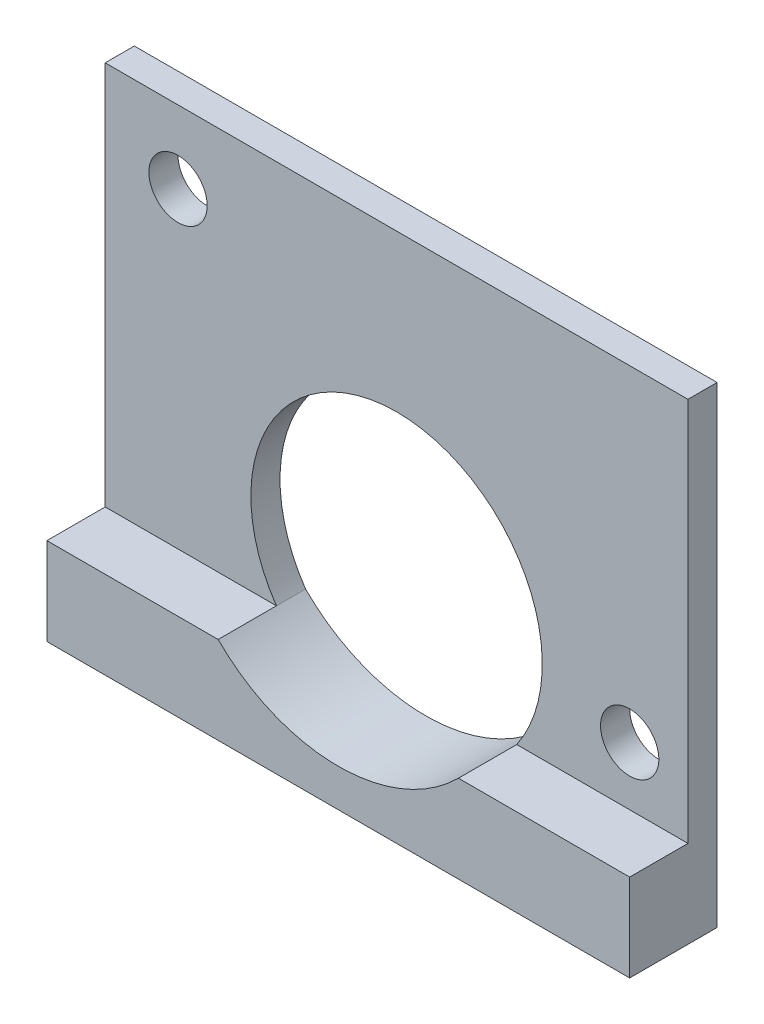
ISO-10303-21;
HEADER;
FILE_DESCRIPTION(('STEP AP214'),'2;1');
FILE_NAME('part.step','',(''),(''),'','','');
FILE_SCHEMA(('AUTOMOTIVE_DESIGN { 1 0 10303 214 1 1 1 1 }'));
ENDSEC;
DATA;
#1=APPLICATION_CONTEXT('core data for automotive mechanical design processes');
#2=APPLICATION_PROTOCOL_DEFINITION('international standard','automotive_design',2000,#1);
#3=PRODUCT_CONTEXT('',#1,'mechanical');
#4=PRODUCT('Part','Part','',(#3));
#5=PRODUCT_RELATED_PRODUCT_CATEGORY('part','',(#4));
#6=PRODUCT_DEFINITION_FORMATION('','',#4);
#7=PRODUCT_DEFINITION_CONTEXT('part definition',#1,'design');
#8=PRODUCT_DEFINITION('design','',#6,#7);
#9=PRODUCT_DEFINITION_SHAPE('','',#8);
#10=(LENGTH_UNIT() NAMED_UNIT(*) SI_UNIT(.MILLI.,.METRE.));
#11=(NAMED_UNIT(*) PLANE_ANGLE_UNIT() SI_UNIT($,.RADIAN.));
#12=(NAMED_UNIT(*) SI_UNIT($,.STERADIAN.) SOLID_ANGLE_UNIT());
#13=UNCERTAINTY_MEASURE_WITH_UNIT(LENGTH_MEASURE(1.E-05),#10,'distance_accuracy_value','');
#14=(GEOMETRIC_REPRESENTATION_CONTEXT(3) GLOBAL_UNCERTAINTY_ASSIGNED_CONTEXT((#13)) GLOBAL_UNIT_ASSIGNED_CONTEXT((#10,
#11,#12)) REPRESENTATION_CONTEXT('',''));
#15=CARTESIAN_POINT('',(0.,0.,0.));
#16=DIRECTION('',(0.,0.,1.));
#17=DIRECTION('',(1.,0.,0.));
#18=AXIS2_PLACEMENT_3D('',#15,#16,#17);
#19=CARTESIAN_POINT('',(-99.0344821648403,34.2856142064587,4.));
#20=DIRECTION('',(1.,0.,0.));
#21=DIRECTION('',(0.,0.,-1.));
#22=AXIS2_PLACEMENT_3D('',#19,#20,#21);
#23=PLANE('',#22);
#24=DIRECTION('',(0.,1.,0.));
#25=VECTOR('',#24,1.);
#26=CARTESIAN_POINT('',(-99.0344821648403,41.0856142064587,-10.));
#27=LINE('',#26,#25);
#28=CARTESIAN_POINT('',(-99.0344821648403,38.0856142064587,-10.));
#29=VERTEX_POINT('',#28);
#30=CARTESIAN_POINT('',(-99.0344821648403,54.2856142064587,-10.));
#31=VERTEX_POINT('',#30);
#32=EDGE_CURVE('E123',#29,#31,#27,.T.);
#33=ORIENTED_EDGE('',*,*,#32,.F.);
#34=DIRECTION('',(0.,0.,-1.));
#35=VECTOR('',#34,1.);
#36=CARTESIAN_POINT('',(-99.0344821648403,38.0856142064587,-7.));
#37=LINE('',#36,#35);
#38=CARTESIAN_POINT('',(-99.0344821648403,38.0856142064587,-7.));
#39=VERTEX_POINT('',#38);
#40=EDGE_CURVE('E169',#39,#29,#37,.T.);
#41=ORIENTED_EDGE('',*,*,#40,.F.);
#42=DIRECTION('',(0.,1.,0.));
#43=VECTOR('',#42,1.);
#44=CARTESIAN_POINT('',(-99.0344821648403,41.0856142064587,-7.));
#45=LINE('',#44,#43);
#46=CARTESIAN_POINT('',(-99.0344821648403,41.0856142064587,-7.));
#47=VERTEX_POINT('',#46);
#48=EDGE_CURVE('E228',#39,#47,#45,.T.);
#49=ORIENTED_EDGE('',*,*,#48,.T.);
#50=DIRECTION('',(0.,0.,-1.));
#51=VECTOR('',#50,1.);
#52=CARTESIAN_POINT('',(-99.0344821648403,41.0856142064587,-7.));
#53=LINE('',#52,#51);
#54=CARTESIAN_POINT('',(-99.0344821648403,41.0856142064587,-9.));
#55=VERTEX_POINT('',#54);
#56=EDGE_CURVE('E166',#47,#55,#53,.T.);
#57=ORIENTED_EDGE('',*,*,#56,.T.);
#58=DIRECTION('',(0.,-1.,0.));
#59=VECTOR('',#58,1.);
#60=CARTESIAN_POINT('',(-99.0344821648403,34.2856142064587,-9.));
#61=LINE('',#60,#59);
#62=CARTESIAN_POINT('',(-99.0344821648403,54.2856142064587,-9.));
#63=VERTEX_POINT('',#62);
#64=EDGE_CURVE('E154',#63,#55,#61,.T.);
#65=ORIENTED_EDGE('',*,*,#64,.F.);
#66=DIRECTION('',(0.,0.,-1.));
#67=VECTOR('',#66,1.);
#68=CARTESIAN_POINT('',(-99.0344821648403,54.2856142064587,4.));
#69=LINE('',#68,#67);
#70=EDGE_CURVE('E11',#63,#31,#69,.T.);
#71=ORIENTED_EDGE('',*,*,#70,.T.);
#72=EDGE_LOOP('',(#33,#41,#49,#57,#65,#71));
#73=FACE_BOUND('',#72,.T.);
#74=ADVANCED_FACE('F33',(#73),#23,.F.);
#75=CARTESIAN_POINT('',(-79.0344821648403,42.2856142064587,4.));
#76=DIRECTION('',(-1.,0.,0.));
#77=DIRECTION('',(0.,0.,1.));
#78=AXIS2_PLACEMENT_3D('',#75,#76,#77);
#79=PLANE('',#78);
#80=DIRECTION('',(0.,-1.,0.));
#81=VECTOR('',#80,1.);
#82=CARTESIAN_POINT('',(-79.0344821648403,47.2856142064587,-10.));
#83=LINE('',#82,#81);
#84=CARTESIAN_POINT('',(-79.0344821648403,54.2856142064587,-10.));
#85=VERTEX_POINT('',#84);
#86=CARTESIAN_POINT('',(-79.0344821648403,38.0856142064587,-10.));
#87=VERTEX_POINT('',#86);
#88=EDGE_CURVE('E99',#85,#87,#83,.T.);
#89=ORIENTED_EDGE('',*,*,#88,.F.);
#90=DIRECTION('',(0.,0.,-1.));
#91=VECTOR('',#90,1.);
#92=CARTESIAN_POINT('',(-79.0344821648403,54.2856142064587,-7.));
#93=LINE('',#92,#91);
#94=CARTESIAN_POINT('',(-79.0344821648403,54.2856142064587,-9.));
#95=VERTEX_POINT('',#94);
#96=EDGE_CURVE('E103',#95,#85,#93,.T.);
#97=ORIENTED_EDGE('',*,*,#96,.F.);
#98=DIRECTION('',(0.,-1.,0.));
#99=VECTOR('',#98,1.);
#100=CARTESIAN_POINT('',(-79.0344821648403,42.2856142064587,-9.));
#101=LINE('',#100,#99);
#102=CARTESIAN_POINT('',(-79.0344821648403,41.0856142064587,-9.));
#103=VERTEX_POINT('',#102);
#104=EDGE_CURVE('E186',#95,#103,#101,.T.);
#105=ORIENTED_EDGE('',*,*,#104,.T.);
#106=DIRECTION('',(0.,0.,-1.));
#107=VECTOR('',#106,1.);
#108=CARTESIAN_POINT('',(-79.0344821648403,41.0856142064587,-7.));
#109=LINE('',#108,#107);
#110=CARTESIAN_POINT('',(-79.0344821648403,41.0856142064587,-7.));
#111=VERTEX_POINT('',#110);
#112=EDGE_CURVE('E178',#111,#103,#109,.T.);
#113=ORIENTED_EDGE('',*,*,#112,.F.);
#114=DIRECTION('',(0.,-1.,0.));
#115=VECTOR('',#114,1.);
#116=CARTESIAN_POINT('',(-79.0344821648403,38.0856142064587,-7.));
#117=LINE('',#116,#115);
#118=CARTESIAN_POINT('',(-79.0344821648403,38.0856142064587,-7.));
#119=VERTEX_POINT('',#118);
#120=EDGE_CURVE('E231',#111,#119,#117,.T.);
#121=ORIENTED_EDGE('',*,*,#120,.T.);
#122=DIRECTION('',(0.,0.,-1.));
#123=VECTOR('',#122,1.);
#124=CARTESIAN_POINT('',(-79.0344821648403,38.0856142064587,-7.));
#125=LINE('',#124,#123);
#126=EDGE_CURVE('E106',#119,#87,#125,.T.);
#127=ORIENTED_EDGE('',*,*,#126,.T.);
#128=EDGE_LOOP('',(#89,#97,#105,#113,#121,#127));
#129=FACE_BOUND('',#128,.T.);
#130=ADVANCED_FACE('F101',(#129),#79,.F.);
#131=CARTESIAN_POINT('',(-79.0344821648403,54.2856142064587,4.));
#132=DIRECTION('',(0.,-1.,0.));
#133=DIRECTION('',(0.,0.,-1.));
#134=AXIS2_PLACEMENT_3D('',#131,#132,#133);
#135=PLANE('',#134);
#136=DIRECTION('',(-1.,0.,0.));
#137=VECTOR('',#136,1.);
#138=CARTESIAN_POINT('',(-99.0344821648403,54.2856142064587,-9.));
#139=LINE('',#138,#137);
#140=EDGE_CURVE('E117',#95,#63,#139,.T.);
#141=ORIENTED_EDGE('',*,*,#140,.F.);
#142=ORIENTED_EDGE('',*,*,#96,.T.);
#143=DIRECTION('',(1.,0.,0.));
#144=VECTOR('',#143,1.);
#145=CARTESIAN_POINT('',(-99.0344821648403,54.2856142064587,-10.));
#146=LINE('',#145,#144);
#147=EDGE_CURVE('E111',#31,#85,#146,.T.);
#148=ORIENTED_EDGE('',*,*,#147,.F.);
#149=ORIENTED_EDGE('',*,*,#70,.F.);
#150=EDGE_LOOP('',(#141,#142,#148,#149));
#151=FACE_BOUND('',#150,.T.);
#152=ADVANCED_FACE('F115',(#151),#135,.F.);
#153=CARTESIAN_POINT('',(-89.0344821648403,43.9136285796139,-9.));
#154=DIRECTION('',(0.,0.,-1.));
#155=DIRECTION('',(-1.,0.,0.));
#156=AXIS2_PLACEMENT_3D('',#153,#154,#155);
#157=PLANE('',#156);
#158=ORIENTED_EDGE('',*,*,#104,.F.);
#159=ORIENTED_EDGE('',*,*,#140,.T.);
#160=ORIENTED_EDGE('',*,*,#64,.T.);
#161=DIRECTION('',(-1.,0.,0.));
#162=VECTOR('',#161,1.);
#163=CARTESIAN_POINT('',(-94.4393257985847,41.0856142064587,-9.));
#164=LINE('',#163,#162);
#165=CARTESIAN_POINT('',(-93.1578709053337,41.0856142064587,-9.));
#166=VERTEX_POINT('',#165);
#167=EDGE_CURVE('E131',#166,#55,#164,.T.);
#168=ORIENTED_EDGE('',*,*,#167,.F.);
#169=CARTESIAN_POINT('',(-89.0344821648403,43.9136285796139,-9.));
#170=DIRECTION('',(0.,0.,1.));
#171=DIRECTION('',(-1.,0.,0.));
#172=AXIS2_PLACEMENT_3D('',#169,#170,#171);
#173=CIRCLE('',#172,5.00000000000001);
#174=CARTESIAN_POINT('',(-84.9110934243469,41.0856142064587,-9.));
#175=VERTEX_POINT('',#174);
#176=EDGE_CURVE('E125',#175,#166,#173,.T.);
#177=ORIENTED_EDGE('',*,*,#176,.F.);
#178=DIRECTION('',(-1.,0.,0.));
#179=VECTOR('',#178,1.);
#180=CARTESIAN_POINT('',(-84.9110934243469,41.0856142064587,-9.));
#181=LINE('',#180,#179);
#182=EDGE_CURVE('E134',#103,#175,#181,.T.);
#183=ORIENTED_EDGE('',*,*,#182,.F.);
#184=EDGE_LOOP('',(#158,#159,#160,#168,#177,#183));
#185=FACE_BOUND('',#184,.T.);
#186=CARTESIAN_POINT('',(-96.5344821648403,51.7856142064587,-9.));
#187=DIRECTION('',(0.,0.,-1.));
#188=DIRECTION('',(-1.,0.,0.));
#189=AXIS2_PLACEMENT_3D('',#186,#187,#188);
#190=CIRCLE('',#189,0.999999999999998);
#191=CARTESIAN_POINT('',(-97.5344821648403,51.7856142064587,-9.));
#192=VERTEX_POINT('',#191);
#193=EDGE_CURVE('E36',#192,#192,#190,.F.);
#194=ORIENTED_EDGE('',*,*,#193,.F.);
#195=EDGE_LOOP('',(#194));
#196=FACE_BOUND('',#195,.T.);
#197=CARTESIAN_POINT('',(-81.0344821648403,43.0856142064587,-9.));
#198=DIRECTION('',(0.,0.,-1.));
#199=DIRECTION('',(-1.,0.,0.));
#200=AXIS2_PLACEMENT_3D('',#197,#198,#199);
#201=CIRCLE('',#200,0.999999999999998);
#202=CARTESIAN_POINT('',(-82.0344821648403,43.0856142064587,-9.));
#203=VERTEX_POINT('',#202);
#204=EDGE_CURVE('E183',#203,#203,#201,.F.);
#205=ORIENTED_EDGE('',*,*,#204,.F.);
#206=EDGE_LOOP('',(#205));
#207=FACE_BOUND('',#206,.T.);
#208=ADVANCED_FACE('F151',(#185,#196,#207),#157,.F.);
#209=CARTESIAN_POINT('',(-89.0344821648403,43.9136285796139,-10.));
#210=DIRECTION('',(0.,0.,-1.));
#211=DIRECTION('',(-1.,0.,0.));
#212=AXIS2_PLACEMENT_3D('',#209,#210,#211);
#213=PLANE('',#212);
#214=ORIENTED_EDGE('',*,*,#147,.T.);
#215=ORIENTED_EDGE('',*,*,#88,.T.);
#216=DIRECTION('',(-1.,0.,0.));
#217=VECTOR('',#216,1.);
#218=CARTESIAN_POINT('',(-99.0344821648403,38.0856142064587,-10.));
#219=LINE('',#218,#217);
#220=EDGE_CURVE('E172',#87,#29,#219,.T.);
#221=ORIENTED_EDGE('',*,*,#220,.T.);
#222=ORIENTED_EDGE('',*,*,#32,.T.);
#223=EDGE_LOOP('',(#214,#215,#221,#222));
#224=FACE_BOUND('',#223,.T.);
#225=CARTESIAN_POINT('',(-96.5344821648403,51.7856142064587,-10.));
#226=DIRECTION('',(0.,0.,-1.));
#227=DIRECTION('',(-1.,0.,0.));
#228=AXIS2_PLACEMENT_3D('',#225,#226,#227);
#229=CIRCLE('',#228,1.00000000000001);
#230=CARTESIAN_POINT('',(-97.5344821648403,51.7856142064587,-10.));
#231=VERTEX_POINT('',#230);
#232=EDGE_CURVE('E135',#231,#231,#229,.T.);
#233=ORIENTED_EDGE('',*,*,#232,.F.);
#234=EDGE_LOOP('',(#233));
#235=FACE_BOUND('',#234,.T.);
#236=CARTESIAN_POINT('',(-89.0344821648403,43.9136285796139,-10.));
#237=DIRECTION('',(0.,0.,1.));
#238=DIRECTION('',(-1.,0.,0.));
#239=AXIS2_PLACEMENT_3D('',#236,#237,#238);
#240=CIRCLE('',#239,5.00000000000001);
#241=CARTESIAN_POINT('',(-84.9110934243469,41.0856142064587,-10.));
#242=VERTEX_POINT('',#241);
#243=CARTESIAN_POINT('',(-93.1578709053337,41.0856142064587,-10.));
#244=VERTEX_POINT('',#243);
#245=EDGE_CURVE('E48',#242,#244,#240,.T.);
#246=ORIENTED_EDGE('',*,*,#245,.T.);
#247=CARTESIAN_POINT('',(-89.0344821648403,45.209002946952,-10.));
#248=DIRECTION('',(0.,0.,1.));
#249=DIRECTION('',(1.,0.,0.));
#250=AXIS2_PLACEMENT_3D('',#247,#248,#249);
#251=CIRCLE('',#250,5.83135227974222);
#252=EDGE_CURVE('E118',#244,#242,#251,.T.);
#253=ORIENTED_EDGE('',*,*,#252,.T.);
#254=EDGE_LOOP('',(#246,#253));
#255=FACE_BOUND('',#254,.T.);
#256=CARTESIAN_POINT('',(-81.0344821648403,43.0856142064587,-10.));
#257=DIRECTION('',(0.,0.,-1.));
#258=DIRECTION('',(-1.,0.,0.));
#259=AXIS2_PLACEMENT_3D('',#256,#257,#258);
#260=CIRCLE('',#259,0.999999999999998);
#261=CARTESIAN_POINT('',(-82.0344821648403,43.0856142064587,-10.));
#262=VERTEX_POINT('',#261);
#263=EDGE_CURVE('E188',#262,#262,#260,.T.);
#264=ORIENTED_EDGE('',*,*,#263,.F.);
#265=EDGE_LOOP('',(#264));
#266=FACE_BOUND('',#265,.T.);
#267=ADVANCED_FACE('F121',(#224,#235,#255,#266),#213,.T.);
#268=CARTESIAN_POINT('',(-89.0344821648403,43.9136285796139,-10.));
#269=DIRECTION('',(0.,0.,1.));
#270=DIRECTION('',(1.,0.,0.));
#271=AXIS2_PLACEMENT_3D('',#268,#269,#270);
#272=CYLINDRICAL_SURFACE('',#271,5.00000000000001);
#273=ORIENTED_EDGE('',*,*,#176,.T.);
#274=DIRECTION('',(0.,0.,1.));
#275=VECTOR('',#274,1.);
#276=CARTESIAN_POINT('',(-93.1578709053337,41.0856142064587,-10.));
#277=LINE('',#276,#275);
#278=EDGE_CURVE('E130',#244,#166,#277,.T.);
#279=ORIENTED_EDGE('',*,*,#278,.F.);
#280=ORIENTED_EDGE('',*,*,#245,.F.);
#281=DIRECTION('',(0.,0.,1.));
#282=VECTOR('',#281,1.);
#283=CARTESIAN_POINT('',(-84.9110934243469,41.0856142064587,-10.));
#284=LINE('',#283,#282);
#285=EDGE_CURVE('E42',#242,#175,#284,.T.);
#286=ORIENTED_EDGE('',*,*,#285,.T.);
#287=EDGE_LOOP('',(#273,#279,#280,#286));
#288=FACE_BOUND('',#287,.T.);
#289=ADVANCED_FACE('F144',(#288),#272,.F.);
#290=CARTESIAN_POINT('',(-81.0344821648403,43.0856142064587,-5.));
#291=DIRECTION('',(0.,0.,-1.));
#292=DIRECTION('',(-1.,0.,0.));
#293=AXIS2_PLACEMENT_3D('',#290,#291,#292);
#294=CYLINDRICAL_SURFACE('',#293,0.999999999999998);
#295=ORIENTED_EDGE('',*,*,#204,.T.);
#296=EDGE_LOOP('',(#295));
#297=FACE_BOUND('',#296,.T.);
#298=ORIENTED_EDGE('',*,*,#263,.T.);
#299=EDGE_LOOP('',(#298));
#300=FACE_BOUND('',#299,.T.);
#301=ADVANCED_FACE('F199',(#297,#300),#294,.F.);
#302=CARTESIAN_POINT('',(-96.5344821648403,51.7856142064587,-5.));
#303=DIRECTION('',(0.,0.,-1.));
#304=DIRECTION('',(-1.,0.,0.));
#305=AXIS2_PLACEMENT_3D('',#302,#303,#304);
#306=CYLINDRICAL_SURFACE('',#305,0.999999999999998);
#307=ORIENTED_EDGE('',*,*,#193,.T.);
#308=EDGE_LOOP('',(#307));
#309=FACE_BOUND('',#308,.T.);
#310=ORIENTED_EDGE('',*,*,#232,.T.);
#311=EDGE_LOOP('',(#310));
#312=FACE_BOUND('',#311,.T.);
#313=ADVANCED_FACE('F193',(#309,#312),#306,.F.);
#314=CARTESIAN_POINT('',(-99.0344821648403,41.0856142064587,-7.));
#315=DIRECTION('',(0.,1.,0.));
#316=DIRECTION('',(0.,0.,1.));
#317=AXIS2_PLACEMENT_3D('',#314,#315,#316);
#318=PLANE('',#317);
#319=ORIENTED_EDGE('',*,*,#167,.T.);
#320=ORIENTED_EDGE('',*,*,#56,.F.);
#321=DIRECTION('',(1.,0.,0.));
#322=VECTOR('',#321,1.);
#323=CARTESIAN_POINT('',(-99.0344821648403,41.0856142064587,-7.));
#324=LINE('',#323,#322);
#325=CARTESIAN_POINT('',(-93.1578709053337,41.0856142064587,-7.));
#326=VERTEX_POINT('',#325);
#327=EDGE_CURVE('E165',#47,#326,#324,.T.);
#328=ORIENTED_EDGE('',*,*,#327,.T.);
#329=DIRECTION('',(0.,0.,-1.));
#330=VECTOR('',#329,1.);
#331=CARTESIAN_POINT('',(-93.1578709053337,41.0856142064587,-7.));
#332=LINE('',#331,#330);
#333=EDGE_CURVE('E160',#326,#166,#332,.T.);
#334=ORIENTED_EDGE('',*,*,#333,.T.);
#335=EDGE_LOOP('',(#319,#320,#328,#334));
#336=FACE_BOUND('',#335,.T.);
#337=ADVANCED_FACE('F163',(#336),#318,.T.);
#338=CARTESIAN_POINT('',(-84.9110934243469,41.0856142064587,-7.));
#339=DIRECTION('',(0.,1.,0.));
#340=DIRECTION('',(0.,0.,1.));
#341=AXIS2_PLACEMENT_3D('',#338,#339,#340);
#342=PLANE('',#341);
#343=ORIENTED_EDGE('',*,*,#182,.T.);
#344=DIRECTION('',(0.,0.,-1.));
#345=VECTOR('',#344,1.);
#346=CARTESIAN_POINT('',(-84.9110934243469,41.0856142064587,-7.));
#347=LINE('',#346,#345);
#348=CARTESIAN_POINT('',(-84.9110934243469,41.0856142064587,-7.));
#349=VERTEX_POINT('',#348);
#350=EDGE_CURVE('E180',#349,#175,#347,.T.);
#351=ORIENTED_EDGE('',*,*,#350,.F.);
#352=DIRECTION('',(1.,0.,0.));
#353=VECTOR('',#352,1.);
#354=CARTESIAN_POINT('',(-84.9110934243469,41.0856142064587,-7.));
#355=LINE('',#354,#353);
#356=EDGE_CURVE('E224',#349,#111,#355,.T.);
#357=ORIENTED_EDGE('',*,*,#356,.T.);
#358=ORIENTED_EDGE('',*,*,#112,.T.);
#359=EDGE_LOOP('',(#343,#351,#357,#358));
#360=FACE_BOUND('',#359,.T.);
#361=ADVANCED_FACE('F236',(#360),#342,.T.);
#362=CARTESIAN_POINT('',(-89.0344821648403,45.209002946952,-7.));
#363=DIRECTION('',(0.,0.,-1.));
#364=DIRECTION('',(-1.,0.,0.));
#365=AXIS2_PLACEMENT_3D('',#362,#363,#364);
#366=CYLINDRICAL_SURFACE('',#365,5.83135227974222);
#367=ORIENTED_EDGE('',*,*,#252,.F.);
#368=ORIENTED_EDGE('',*,*,#278,.T.);
#369=ORIENTED_EDGE('',*,*,#333,.F.);
#370=CARTESIAN_POINT('',(-89.0344821648403,45.209002946952,-7.));
#371=DIRECTION('',(0.,0.,1.));
#372=DIRECTION('',(1.,0.,0.));
#373=AXIS2_PLACEMENT_3D('',#370,#371,#372);
#374=CIRCLE('',#373,5.83135227974222);
#375=EDGE_CURVE('E223',#326,#349,#374,.T.);
#376=ORIENTED_EDGE('',*,*,#375,.T.);
#377=ORIENTED_EDGE('',*,*,#350,.T.);
#378=ORIENTED_EDGE('',*,*,#285,.F.);
#379=EDGE_LOOP('',(#367,#368,#369,#376,#377,#378));
#380=FACE_BOUND('',#379,.T.);
#381=ADVANCED_FACE('F158',(#380),#366,.F.);
#382=CARTESIAN_POINT('',(-99.0344821648403,38.0856142064587,-7.));
#383=DIRECTION('',(0.,-1.,0.));
#384=DIRECTION('',(0.,0.,-1.));
#385=AXIS2_PLACEMENT_3D('',#382,#383,#384);
#386=PLANE('',#385);
#387=ORIENTED_EDGE('',*,*,#220,.F.);
#388=ORIENTED_EDGE('',*,*,#126,.F.);
#389=DIRECTION('',(-1.,0.,0.));
#390=VECTOR('',#389,1.);
#391=CARTESIAN_POINT('',(-99.0344821648403,38.0856142064587,-7.));
#392=LINE('',#391,#390);
#393=EDGE_CURVE('E222',#119,#39,#392,.T.);
#394=ORIENTED_EDGE('',*,*,#393,.T.);
#395=ORIENTED_EDGE('',*,*,#40,.T.);
#396=EDGE_LOOP('',(#387,#388,#394,#395));
#397=FACE_BOUND('',#396,.T.);
#398=ADVANCED_FACE('F220',(#397),#386,.T.);
#399=CARTESIAN_POINT('',(-89.0344821648403,45.209002946952,-7.));
#400=DIRECTION('',(0.,0.,1.));
#401=DIRECTION('',(1.,0.,0.));
#402=AXIS2_PLACEMENT_3D('',#399,#400,#401);
#403=PLANE('',#402);
#404=ORIENTED_EDGE('',*,*,#375,.F.);
#405=ORIENTED_EDGE('',*,*,#327,.F.);
#406=ORIENTED_EDGE('',*,*,#48,.F.);
#407=ORIENTED_EDGE('',*,*,#393,.F.);
#408=ORIENTED_EDGE('',*,*,#120,.F.);
#409=ORIENTED_EDGE('',*,*,#356,.F.);
#410=EDGE_LOOP('',(#404,#405,#406,#407,#408,#409));
#411=FACE_BOUND('',#410,.T.);
#412=ADVANCED_FACE('F239',(#411),#403,.T.);
#413=CLOSED_SHELL('',(#74,#130,#152,#208,#267,#289,#301,#313,#337,#361,#381,#398,#412));
#414=MANIFOLD_SOLID_BREP('B2',#413);
#415=ADVANCED_BREP_SHAPE_REPRESENTATION('',(#18,#414),#14);
#416=SHAPE_DEFINITION_REPRESENTATION(#9,#415);
ENDSEC;
END-ISO-10303-21;
